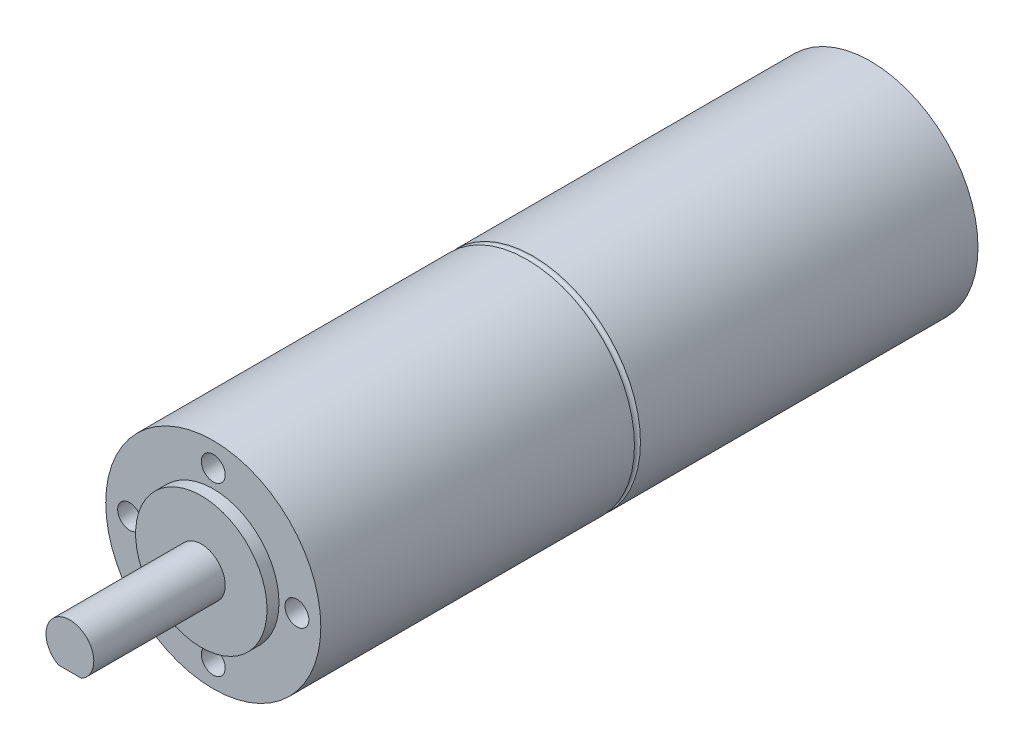
ISO-10303-21;
HEADER;
FILE_DESCRIPTION(('STEP AP214'),'2;1');
FILE_NAME('part.step','',(''),(''),'','','');
FILE_SCHEMA(('AUTOMOTIVE_DESIGN { 1 0 10303 214 1 1 1 1 }'));
ENDSEC;
DATA;
#1=APPLICATION_CONTEXT('core data for automotive mechanical design processes');
#2=APPLICATION_PROTOCOL_DEFINITION('international standard','automotive_design',2000,#1);
#3=PRODUCT_CONTEXT('',#1,'mechanical');
#4=PRODUCT('Part','Part','',(#3));
#5=PRODUCT_RELATED_PRODUCT_CATEGORY('part','',(#4));
#6=PRODUCT_DEFINITION_FORMATION('','',#4);
#7=PRODUCT_DEFINITION_CONTEXT('part definition',#1,'design');
#8=PRODUCT_DEFINITION('design','',#6,#7);
#9=PRODUCT_DEFINITION_SHAPE('','',#8);
#10=(LENGTH_UNIT() NAMED_UNIT(*) SI_UNIT(.MILLI.,.METRE.));
#11=(NAMED_UNIT(*) PLANE_ANGLE_UNIT() SI_UNIT($,.RADIAN.));
#12=(NAMED_UNIT(*) SI_UNIT($,.STERADIAN.) SOLID_ANGLE_UNIT());
#13=UNCERTAINTY_MEASURE_WITH_UNIT(LENGTH_MEASURE(1.E-05),#10,'distance_accuracy_value','');
#14=(GEOMETRIC_REPRESENTATION_CONTEXT(3) GLOBAL_UNCERTAINTY_ASSIGNED_CONTEXT((#13)) GLOBAL_UNIT_ASSIGNED_CONTEXT((#10,
#11,#12)) REPRESENTATION_CONTEXT('',''));
#15=CARTESIAN_POINT('',(0.,0.,0.));
#16=DIRECTION('',(0.,0.,1.));
#17=DIRECTION('',(1.,0.,0.));
#18=AXIS2_PLACEMENT_3D('',#15,#16,#17);
#19=CARTESIAN_POINT('',(0.,0.,110.));
#20=DIRECTION('',(0.,0.,-1.));
#21=DIRECTION('',(-1.,0.,0.));
#22=AXIS2_PLACEMENT_3D('',#19,#20,#21);
#23=CYLINDRICAL_SURFACE('',#22,18.);
#24=CARTESIAN_POINT('',(0.,0.,0.));
#25=DIRECTION('',(0.,0.,1.));
#26=DIRECTION('',(1.,0.,0.));
#27=AXIS2_PLACEMENT_3D('',#24,#25,#26);
#28=CIRCLE('',#27,18.);
#29=CARTESIAN_POINT('',(18.,0.,0.));
#30=VERTEX_POINT('',#29);
#31=EDGE_CURVE('E104',#30,#30,#28,.T.);
#32=ORIENTED_EDGE('',*,*,#31,.T.);
#33=EDGE_LOOP('',(#32));
#34=FACE_BOUND('',#33,.T.);
#35=CARTESIAN_POINT('',(0.,0.,56.5));
#36=DIRECTION('',(0.,0.,1.));
#37=DIRECTION('',(1.,0.,0.));
#38=AXIS2_PLACEMENT_3D('',#35,#36,#37);
#39=CIRCLE('',#38,18.);
#40=CARTESIAN_POINT('',(18.,0.,56.5));
#41=VERTEX_POINT('',#40);
#42=EDGE_CURVE('E42',#41,#41,#39,.T.);
#43=ORIENTED_EDGE('',*,*,#42,.F.);
#44=EDGE_LOOP('',(#43));
#45=FACE_BOUND('',#44,.T.);
#46=ADVANCED_FACE('F39',(#34,#45),#23,.T.);
#47=CARTESIAN_POINT('',(0.,0.,0.));
#48=DIRECTION('',(0.,0.,1.));
#49=DIRECTION('',(1.,0.,0.));
#50=AXIS2_PLACEMENT_3D('',#47,#48,#49);
#51=PLANE('',#50);
#52=CARTESIAN_POINT('',(0.,0.,0.));
#53=DIRECTION('',(0.,0.,-1.));
#54=DIRECTION('',(-1.,0.,0.));
#55=AXIS2_PLACEMENT_3D('',#52,#53,#54);
#56=CIRCLE('',#55,5.);
#57=CARTESIAN_POINT('',(-5.,0.,0.));
#58=VERTEX_POINT('',#57);
#59=EDGE_CURVE('E11',#58,#58,#56,.T.);
#60=ORIENTED_EDGE('',*,*,#59,.F.);
#61=EDGE_LOOP('',(#60));
#62=FACE_BOUND('',#61,.T.);
#63=ORIENTED_EDGE('',*,*,#31,.F.);
#64=EDGE_LOOP('',(#63));
#65=FACE_BOUND('',#64,.T.);
#66=ADVANCED_FACE('F118',(#62,#65),#51,.F.);
#67=CARTESIAN_POINT('',(0.,0.,57.));
#68=DIRECTION('',(0.,0.,-1.));
#69=DIRECTION('',(-1.,0.,0.));
#70=AXIS2_PLACEMENT_3D('',#67,#68,#69);
#71=TOROIDAL_SURFACE('',#70,18.,0.499999999999999);
#72=CARTESIAN_POINT('',(0.,0.,57.5));
#73=DIRECTION('',(0.,0.,-1.));
#74=DIRECTION('',(-1.,0.,0.));
#75=AXIS2_PLACEMENT_3D('',#72,#73,#74);
#76=CIRCLE('',#75,18.);
#77=CARTESIAN_POINT('',(-18.,0.,57.5));
#78=VERTEX_POINT('',#77);
#79=EDGE_CURVE('E89',#78,#78,#76,.T.);
#80=ORIENTED_EDGE('',*,*,#79,.T.);
#81=EDGE_LOOP('',(#80));
#82=FACE_BOUND('',#81,.T.);
#83=ORIENTED_EDGE('',*,*,#42,.T.);
#84=EDGE_LOOP('',(#83));
#85=FACE_BOUND('',#84,.T.);
#86=ADVANCED_FACE('F115',(#82,#85),#71,.F.);
#87=CARTESIAN_POINT('',(0.,0.,110.));
#88=DIRECTION('',(0.,0.,1.));
#89=DIRECTION('',(1.,0.,0.));
#90=AXIS2_PLACEMENT_3D('',#87,#88,#89);
#91=PLANE('',#90);
#92=CARTESIAN_POINT('',(14.,0.,110.));
#93=DIRECTION('',(0.,0.,1.));
#94=DIRECTION('',(1.,0.,0.));
#95=AXIS2_PLACEMENT_3D('',#92,#93,#94);
#96=CIRCLE('',#95,2.);
#97=CARTESIAN_POINT('',(16.,0.,110.));
#98=VERTEX_POINT('',#97);
#99=EDGE_CURVE('E206',#98,#98,#96,.T.);
#100=ORIENTED_EDGE('',*,*,#99,.F.);
#101=EDGE_LOOP('',(#100));
#102=FACE_BOUND('',#101,.T.);
#103=CARTESIAN_POINT('',(0.,-14.,110.));
#104=DIRECTION('',(0.,0.,1.));
#105=DIRECTION('',(1.,0.,0.));
#106=AXIS2_PLACEMENT_3D('',#103,#104,#105);
#107=CIRCLE('',#106,2.00000000000001);
#108=CARTESIAN_POINT('',(1.99999999999996,-14.,110.));
#109=VERTEX_POINT('',#108);
#110=EDGE_CURVE('E219',#109,#109,#107,.T.);
#111=ORIENTED_EDGE('',*,*,#110,.F.);
#112=EDGE_LOOP('',(#111));
#113=FACE_BOUND('',#112,.T.);
#114=CARTESIAN_POINT('',(-14.,0.,110.));
#115=DIRECTION('',(0.,0.,1.));
#116=DIRECTION('',(1.,0.,0.));
#117=AXIS2_PLACEMENT_3D('',#114,#115,#116);
#118=CIRCLE('',#117,2.);
#119=CARTESIAN_POINT('',(-12.,0.,110.));
#120=VERTEX_POINT('',#119);
#121=EDGE_CURVE('E227',#120,#120,#118,.T.);
#122=ORIENTED_EDGE('',*,*,#121,.F.);
#123=EDGE_LOOP('',(#122));
#124=FACE_BOUND('',#123,.T.);
#125=CARTESIAN_POINT('',(1.46642216231412E-13,14.,110.));
#126=DIRECTION('',(0.,0.,1.));
#127=DIRECTION('',(1.,0.,0.));
#128=AXIS2_PLACEMENT_3D('',#125,#126,#127);
#129=CIRCLE('',#128,2.00000000000001);
#130=CARTESIAN_POINT('',(2.00000000000015,14.,110.));
#131=VERTEX_POINT('',#130);
#132=EDGE_CURVE('E235',#131,#131,#129,.T.);
#133=ORIENTED_EDGE('',*,*,#132,.F.);
#134=EDGE_LOOP('',(#133));
#135=FACE_BOUND('',#134,.T.);
#136=CARTESIAN_POINT('',(0.,0.,110.));
#137=DIRECTION('',(0.,0.,1.));
#138=DIRECTION('',(1.,0.,0.));
#139=AXIS2_PLACEMENT_3D('',#136,#137,#138);
#140=CIRCLE('',#139,11.);
#141=CARTESIAN_POINT('',(11.,0.,110.));
#142=VERTEX_POINT('',#141);
#143=EDGE_CURVE('E95',#142,#142,#140,.T.);
#144=ORIENTED_EDGE('',*,*,#143,.F.);
#145=EDGE_LOOP('',(#144));
#146=FACE_BOUND('',#145,.T.);
#147=CARTESIAN_POINT('',(0.,0.,110.));
#148=DIRECTION('',(0.,0.,1.));
#149=DIRECTION('',(1.,0.,0.));
#150=AXIS2_PLACEMENT_3D('',#147,#148,#149);
#151=CIRCLE('',#150,18.);
#152=CARTESIAN_POINT('',(18.,0.,110.));
#153=VERTEX_POINT('',#152);
#154=EDGE_CURVE('E100',#153,#153,#151,.T.);
#155=ORIENTED_EDGE('',*,*,#154,.T.);
#156=EDGE_LOOP('',(#155));
#157=FACE_BOUND('',#156,.T.);
#158=ADVANCED_FACE('F127',(#102,#113,#124,#135,#146,#157),#91,.T.);
#159=ORIENTED_EDGE('',*,*,#154,.F.);
#160=EDGE_LOOP('',(#159));
#161=FACE_BOUND('',#160,.T.);
#162=ORIENTED_EDGE('',*,*,#79,.F.);
#163=EDGE_LOOP('',(#162));
#164=FACE_BOUND('',#163,.T.);
#165=ADVANCED_FACE('F120',(#161,#164),#23,.T.);
#166=CARTESIAN_POINT('',(0.,0.,112.));
#167=DIRECTION('',(0.,0.,-1.));
#168=DIRECTION('',(-1.,0.,0.));
#169=AXIS2_PLACEMENT_3D('',#166,#167,#168);
#170=CYLINDRICAL_SURFACE('',#169,11.);
#171=CARTESIAN_POINT('',(0.,0.,112.));
#172=DIRECTION('',(0.,0.,1.));
#173=DIRECTION('',(1.,0.,0.));
#174=AXIS2_PLACEMENT_3D('',#171,#172,#173);
#175=CIRCLE('',#174,11.);
#176=CARTESIAN_POINT('',(11.,0.,112.));
#177=VERTEX_POINT('',#176);
#178=EDGE_CURVE('E85',#177,#177,#175,.T.);
#179=ORIENTED_EDGE('',*,*,#178,.F.);
#180=EDGE_LOOP('',(#179));
#181=FACE_BOUND('',#180,.T.);
#182=ORIENTED_EDGE('',*,*,#143,.T.);
#183=EDGE_LOOP('',(#182));
#184=FACE_BOUND('',#183,.T.);
#185=ADVANCED_FACE('F126',(#181,#184),#170,.T.);
#186=CARTESIAN_POINT('',(0.,0.,112.));
#187=DIRECTION('',(0.,0.,1.));
#188=DIRECTION('',(1.,0.,0.));
#189=AXIS2_PLACEMENT_3D('',#186,#187,#188);
#190=PLANE('',#189);
#191=CARTESIAN_POINT('',(0.,0.,112.));
#192=DIRECTION('',(0.,0.,1.));
#193=DIRECTION('',(1.,0.,0.));
#194=AXIS2_PLACEMENT_3D('',#191,#192,#193);
#195=CIRCLE('',#194,4.);
#196=CARTESIAN_POINT('',(4.,0.,112.));
#197=VERTEX_POINT('',#196);
#198=EDGE_CURVE('E48',#197,#197,#195,.T.);
#199=ORIENTED_EDGE('',*,*,#198,.F.);
#200=EDGE_LOOP('',(#199));
#201=FACE_BOUND('',#200,.T.);
#202=ORIENTED_EDGE('',*,*,#178,.T.);
#203=EDGE_LOOP('',(#202));
#204=FACE_BOUND('',#203,.T.);
#205=ADVANCED_FACE('F133',(#201,#204),#190,.T.);
#206=CARTESIAN_POINT('',(0.,0.,134.));
#207=DIRECTION('',(0.,0.,-1.));
#208=DIRECTION('',(-1.,0.,0.));
#209=AXIS2_PLACEMENT_3D('',#206,#207,#208);
#210=CYLINDRICAL_SURFACE('',#209,4.);
#211=CARTESIAN_POINT('',(0.,0.,134.));
#212=DIRECTION('',(0.,0.,1.));
#213=DIRECTION('',(1.,0.,0.));
#214=AXIS2_PLACEMENT_3D('',#211,#212,#213);
#215=CIRCLE('',#214,4.);
#216=CARTESIAN_POINT('',(1.93649167310371,-3.5,134.));
#217=VERTEX_POINT('',#216);
#218=CARTESIAN_POINT('',(-1.93649167310371,-3.5,134.));
#219=VERTEX_POINT('',#218);
#220=EDGE_CURVE('E80',#217,#219,#215,.T.);
#221=ORIENTED_EDGE('',*,*,#220,.F.);
#222=DIRECTION('',(0.,0.,1.));
#223=VECTOR('',#222,1.);
#224=CARTESIAN_POINT('',(1.93649167310371,-3.5,119.));
#225=LINE('',#224,#223);
#226=CARTESIAN_POINT('',(1.93649167310371,-3.5,119.));
#227=VERTEX_POINT('',#226);
#228=EDGE_CURVE('E56',#227,#217,#225,.T.);
#229=ORIENTED_EDGE('',*,*,#228,.F.);
#230=CARTESIAN_POINT('',(0.,0.,119.));
#231=DIRECTION('',(0.,0.,1.));
#232=DIRECTION('',(1.,0.,0.));
#233=AXIS2_PLACEMENT_3D('',#230,#231,#232);
#234=CIRCLE('',#233,4.);
#235=CARTESIAN_POINT('',(-1.93649167310371,-3.5,119.));
#236=VERTEX_POINT('',#235);
#237=EDGE_CURVE('E73',#236,#227,#234,.T.);
#238=ORIENTED_EDGE('',*,*,#237,.F.);
#239=DIRECTION('',(0.,0.,1.));
#240=VECTOR('',#239,1.);
#241=CARTESIAN_POINT('',(-1.93649167310371,-3.5,119.));
#242=LINE('',#241,#240);
#243=EDGE_CURVE('E62',#236,#219,#242,.T.);
#244=ORIENTED_EDGE('',*,*,#243,.T.);
#245=EDGE_LOOP('',(#221,#229,#238,#244));
#246=FACE_BOUND('',#245,.T.);
#247=ORIENTED_EDGE('',*,*,#198,.T.);
#248=EDGE_LOOP('',(#247));
#249=FACE_BOUND('',#248,.T.);
#250=ADVANCED_FACE('F78',(#246,#249),#210,.T.);
#251=CARTESIAN_POINT('',(0.,0.,134.));
#252=DIRECTION('',(0.,0.,1.));
#253=DIRECTION('',(1.,0.,0.));
#254=AXIS2_PLACEMENT_3D('',#251,#252,#253);
#255=PLANE('',#254);
#256=DIRECTION('',(-1.,0.,0.));
#257=VECTOR('',#256,1.);
#258=CARTESIAN_POINT('',(-1.93649167310371,-3.5,134.));
#259=LINE('',#258,#257);
#260=EDGE_CURVE('E67',#217,#219,#259,.T.);
#261=ORIENTED_EDGE('',*,*,#260,.F.);
#262=ORIENTED_EDGE('',*,*,#220,.T.);
#263=EDGE_LOOP('',(#261,#262));
#264=FACE_BOUND('',#263,.T.);
#265=ADVANCED_FACE('F83',(#264),#255,.T.);
#266=CARTESIAN_POINT('',(-1.93649167310371,-3.5,119.));
#267=DIRECTION('',(0.,1.,0.));
#268=DIRECTION('',(0.,0.,1.));
#269=AXIS2_PLACEMENT_3D('',#266,#267,#268);
#270=PLANE('',#269);
#271=ORIENTED_EDGE('',*,*,#260,.T.);
#272=ORIENTED_EDGE('',*,*,#243,.F.);
#273=DIRECTION('',(-1.,0.,0.));
#274=VECTOR('',#273,1.);
#275=CARTESIAN_POINT('',(-1.93649167310371,-3.5,119.));
#276=LINE('',#275,#274);
#277=EDGE_CURVE('E241',#227,#236,#276,.T.);
#278=ORIENTED_EDGE('',*,*,#277,.F.);
#279=ORIENTED_EDGE('',*,*,#228,.T.);
#280=EDGE_LOOP('',(#271,#272,#278,#279));
#281=FACE_BOUND('',#280,.T.);
#282=ADVANCED_FACE('F68',(#281),#270,.F.);
#283=CARTESIAN_POINT('',(0.,0.,119.));
#284=DIRECTION('',(0.,0.,1.));
#285=DIRECTION('',(1.,0.,0.));
#286=AXIS2_PLACEMENT_3D('',#283,#284,#285);
#287=PLANE('',#286);
#288=ORIENTED_EDGE('',*,*,#237,.T.);
#289=ORIENTED_EDGE('',*,*,#277,.T.);
#290=EDGE_LOOP('',(#288,#289));
#291=FACE_BOUND('',#290,.T.);
#292=ADVANCED_FACE('F157',(#291),#287,.T.);
#293=CARTESIAN_POINT('',(0.,0.,-1.));
#294=DIRECTION('',(0.,0.,1.));
#295=DIRECTION('',(1.,0.,0.));
#296=AXIS2_PLACEMENT_3D('',#293,#294,#295);
#297=CYLINDRICAL_SURFACE('',#296,5.);
#298=CARTESIAN_POINT('',(0.,0.,-1.));
#299=DIRECTION('',(0.,0.,-1.));
#300=DIRECTION('',(-1.,0.,0.));
#301=AXIS2_PLACEMENT_3D('',#298,#299,#300);
#302=CIRCLE('',#301,5.);
#303=CARTESIAN_POINT('',(-5.,0.,-1.));
#304=VERTEX_POINT('',#303);
#305=EDGE_CURVE('E74',#304,#304,#302,.T.);
#306=ORIENTED_EDGE('',*,*,#305,.F.);
#307=EDGE_LOOP('',(#306));
#308=FACE_BOUND('',#307,.T.);
#309=ORIENTED_EDGE('',*,*,#59,.T.);
#310=EDGE_LOOP('',(#309));
#311=FACE_BOUND('',#310,.T.);
#312=ADVANCED_FACE('F160',(#308,#311),#297,.T.);
#313=CARTESIAN_POINT('',(0.,0.,-1.));
#314=DIRECTION('',(0.,0.,-1.));
#315=DIRECTION('',(-1.,0.,0.));
#316=AXIS2_PLACEMENT_3D('',#313,#314,#315);
#317=PLANE('',#316);
#318=ORIENTED_EDGE('',*,*,#305,.T.);
#319=EDGE_LOOP('',(#318));
#320=FACE_BOUND('',#319,.T.);
#321=ADVANCED_FACE('F164',(#320),#317,.T.);
#322=CARTESIAN_POINT('',(1.46642216231412E-13,14.,100.));
#323=DIRECTION('',(0.,0.,1.));
#324=DIRECTION('',(1.,0.,0.));
#325=AXIS2_PLACEMENT_3D('',#322,#323,#324);
#326=CYLINDRICAL_SURFACE('',#325,2.00000000000001);
#327=CARTESIAN_POINT('',(1.46642216231412E-13,14.,100.));
#328=DIRECTION('',(0.,0.,1.));
#329=DIRECTION('',(1.,0.,0.));
#330=AXIS2_PLACEMENT_3D('',#327,#328,#329);
#331=CIRCLE('',#330,2.00000000000001);
#332=CARTESIAN_POINT('',(2.00000000000015,14.,100.));
#333=VERTEX_POINT('',#332);
#334=EDGE_CURVE('E231',#333,#333,#331,.T.);
#335=ORIENTED_EDGE('',*,*,#334,.F.);
#336=EDGE_LOOP('',(#335));
#337=FACE_BOUND('',#336,.T.);
#338=ORIENTED_EDGE('',*,*,#132,.T.);
#339=EDGE_LOOP('',(#338));
#340=FACE_BOUND('',#339,.T.);
#341=ADVANCED_FACE('F168',(#337,#340),#326,.F.);
#342=CARTESIAN_POINT('',(1.46642216231412E-13,14.,100.));
#343=DIRECTION('',(0.,0.,1.));
#344=DIRECTION('',(1.,0.,0.));
#345=AXIS2_PLACEMENT_3D('',#342,#343,#344);
#346=PLANE('',#345);
#347=ORIENTED_EDGE('',*,*,#334,.T.);
#348=EDGE_LOOP('',(#347));
#349=FACE_BOUND('',#348,.T.);
#350=ADVANCED_FACE('F172',(#349),#346,.T.);
#351=CARTESIAN_POINT('',(-14.,0.,100.));
#352=DIRECTION('',(0.,0.,1.));
#353=DIRECTION('',(1.,0.,0.));
#354=AXIS2_PLACEMENT_3D('',#351,#352,#353);
#355=CYLINDRICAL_SURFACE('',#354,2.);
#356=CARTESIAN_POINT('',(-14.,0.,100.));
#357=DIRECTION('',(0.,0.,1.));
#358=DIRECTION('',(1.,0.,0.));
#359=AXIS2_PLACEMENT_3D('',#356,#357,#358);
#360=CIRCLE('',#359,2.);
#361=CARTESIAN_POINT('',(-12.,0.,100.));
#362=VERTEX_POINT('',#361);
#363=EDGE_CURVE('E223',#362,#362,#360,.T.);
#364=ORIENTED_EDGE('',*,*,#363,.F.);
#365=EDGE_LOOP('',(#364));
#366=FACE_BOUND('',#365,.T.);
#367=ORIENTED_EDGE('',*,*,#121,.T.);
#368=EDGE_LOOP('',(#367));
#369=FACE_BOUND('',#368,.T.);
#370=ADVANCED_FACE('F176',(#366,#369),#355,.F.);
#371=CARTESIAN_POINT('',(-14.,0.,100.));
#372=DIRECTION('',(0.,0.,1.));
#373=DIRECTION('',(1.,0.,0.));
#374=AXIS2_PLACEMENT_3D('',#371,#372,#373);
#375=PLANE('',#374);
#376=ORIENTED_EDGE('',*,*,#363,.T.);
#377=EDGE_LOOP('',(#376));
#378=FACE_BOUND('',#377,.T.);
#379=ADVANCED_FACE('F180',(#378),#375,.T.);
#380=CARTESIAN_POINT('',(0.,-14.,100.));
#381=DIRECTION('',(0.,0.,1.));
#382=DIRECTION('',(1.,0.,0.));
#383=AXIS2_PLACEMENT_3D('',#380,#381,#382);
#384=CYLINDRICAL_SURFACE('',#383,2.00000000000001);
#385=CARTESIAN_POINT('',(0.,-14.,100.));
#386=DIRECTION('',(0.,0.,1.));
#387=DIRECTION('',(1.,0.,0.));
#388=AXIS2_PLACEMENT_3D('',#385,#386,#387);
#389=CIRCLE('',#388,2.00000000000001);
#390=CARTESIAN_POINT('',(1.99999999999996,-14.,100.));
#391=VERTEX_POINT('',#390);
#392=EDGE_CURVE('E213',#391,#391,#389,.T.);
#393=ORIENTED_EDGE('',*,*,#392,.F.);
#394=EDGE_LOOP('',(#393));
#395=FACE_BOUND('',#394,.T.);
#396=ORIENTED_EDGE('',*,*,#110,.T.);
#397=EDGE_LOOP('',(#396));
#398=FACE_BOUND('',#397,.T.);
#399=ADVANCED_FACE('F184',(#395,#398),#384,.F.);
#400=CARTESIAN_POINT('',(0.,-14.,100.));
#401=DIRECTION('',(0.,0.,1.));
#402=DIRECTION('',(1.,0.,0.));
#403=AXIS2_PLACEMENT_3D('',#400,#401,#402);
#404=PLANE('',#403);
#405=ORIENTED_EDGE('',*,*,#392,.T.);
#406=EDGE_LOOP('',(#405));
#407=FACE_BOUND('',#406,.T.);
#408=ADVANCED_FACE('F188',(#407),#404,.T.);
#409=CARTESIAN_POINT('',(14.,0.,100.));
#410=DIRECTION('',(0.,0.,1.));
#411=DIRECTION('',(1.,0.,0.));
#412=AXIS2_PLACEMENT_3D('',#409,#410,#411);
#413=CYLINDRICAL_SURFACE('',#412,2.);
#414=CARTESIAN_POINT('',(14.,0.,100.));
#415=DIRECTION('',(0.,0.,1.));
#416=DIRECTION('',(1.,0.,0.));
#417=AXIS2_PLACEMENT_3D('',#414,#415,#416);
#418=CIRCLE('',#417,2.);
#419=CARTESIAN_POINT('',(16.,0.,100.));
#420=VERTEX_POINT('',#419);
#421=EDGE_CURVE('E204',#420,#420,#418,.T.);
#422=ORIENTED_EDGE('',*,*,#421,.F.);
#423=EDGE_LOOP('',(#422));
#424=FACE_BOUND('',#423,.T.);
#425=ORIENTED_EDGE('',*,*,#99,.T.);
#426=EDGE_LOOP('',(#425));
#427=FACE_BOUND('',#426,.T.);
#428=ADVANCED_FACE('F192',(#424,#427),#413,.F.);
#429=CARTESIAN_POINT('',(14.,0.,100.));
#430=DIRECTION('',(0.,0.,1.));
#431=DIRECTION('',(1.,0.,0.));
#432=AXIS2_PLACEMENT_3D('',#429,#430,#431);
#433=PLANE('',#432);
#434=ORIENTED_EDGE('',*,*,#421,.T.);
#435=EDGE_LOOP('',(#434));
#436=FACE_BOUND('',#435,.T.);
#437=ADVANCED_FACE('F196',(#436),#433,.T.);
#438=CLOSED_SHELL('',(#46,#66,#86,#158,#165,#185,#205,#250,#265,#282,#292,#312,#321,#341,#350,
#370,#379,#399,#408,#428,#437));
#439=MANIFOLD_SOLID_BREP('B2',#438);
#440=ADVANCED_BREP_SHAPE_REPRESENTATION('',(#18,#439),#14);
#441=SHAPE_DEFINITION_REPRESENTATION(#9,#440);
ENDSEC;
END-ISO-10303-21;
